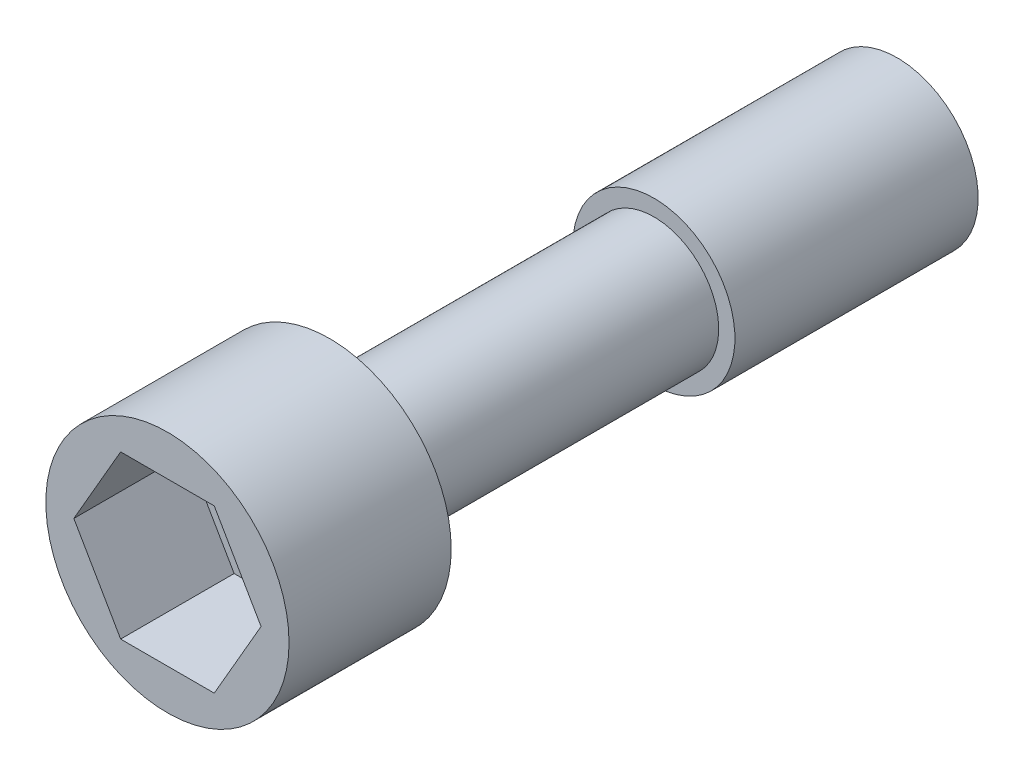
ISO-10303-21;
HEADER;
FILE_DESCRIPTION(('STEP AP214'),'2;1');
FILE_NAME('part.step','',(''),(''),'','','');
FILE_SCHEMA(('AUTOMOTIVE_DESIGN { 1 0 10303 214 1 1 1 1 }'));
ENDSEC;
DATA;
#1=APPLICATION_CONTEXT('core data for automotive mechanical design processes');
#2=APPLICATION_PROTOCOL_DEFINITION('international standard','automotive_design',2000,#1);
#3=PRODUCT_CONTEXT('',#1,'mechanical');
#4=PRODUCT('Part','Part','',(#3));
#5=PRODUCT_RELATED_PRODUCT_CATEGORY('part','',(#4));
#6=PRODUCT_DEFINITION_FORMATION('','',#4);
#7=PRODUCT_DEFINITION_CONTEXT('part definition',#1,'design');
#8=PRODUCT_DEFINITION('design','',#6,#7);
#9=PRODUCT_DEFINITION_SHAPE('','',#8);
#10=(LENGTH_UNIT() NAMED_UNIT(*) SI_UNIT(.MILLI.,.METRE.));
#11=(NAMED_UNIT(*) PLANE_ANGLE_UNIT() SI_UNIT($,.RADIAN.));
#12=(NAMED_UNIT(*) SI_UNIT($,.STERADIAN.) SOLID_ANGLE_UNIT());
#13=UNCERTAINTY_MEASURE_WITH_UNIT(LENGTH_MEASURE(1.E-05),#10,'distance_accuracy_value','');
#14=(GEOMETRIC_REPRESENTATION_CONTEXT(3) GLOBAL_UNCERTAINTY_ASSIGNED_CONTEXT((#13)) GLOBAL_UNIT_ASSIGNED_CONTEXT((#10,
#11,#12)) REPRESENTATION_CONTEXT('',''));
#15=CARTESIAN_POINT('',(0.,0.,0.));
#16=DIRECTION('',(0.,0.,1.));
#17=DIRECTION('',(1.,0.,0.));
#18=AXIS2_PLACEMENT_3D('',#15,#16,#17);
#19=CARTESIAN_POINT('',(0.,0.,10.));
#20=DIRECTION('',(0.,0.,-1.));
#21=DIRECTION('',(-1.,0.,0.));
#22=AXIS2_PLACEMENT_3D('',#19,#20,#21);
#23=CYLINDRICAL_SURFACE('',#22,7.5);
#24=CARTESIAN_POINT('',(0.,0.,10.));
#25=DIRECTION('',(0.,0.,1.));
#26=DIRECTION('',(1.,0.,0.));
#27=AXIS2_PLACEMENT_3D('',#24,#25,#26);
#28=CIRCLE('',#27,7.5);
#29=CARTESIAN_POINT('',(7.5,0.,10.));
#30=VERTEX_POINT('',#29);
#31=EDGE_CURVE('E54',#30,#30,#28,.T.);
#32=ORIENTED_EDGE('',*,*,#31,.F.);
#33=EDGE_LOOP('',(#32));
#34=FACE_BOUND('',#33,.T.);
#35=CARTESIAN_POINT('',(0.,0.,0.));
#36=DIRECTION('',(0.,0.,1.));
#37=DIRECTION('',(1.,0.,0.));
#38=AXIS2_PLACEMENT_3D('',#35,#36,#37);
#39=CIRCLE('',#38,7.5);
#40=CARTESIAN_POINT('',(7.5,0.,0.));
#41=VERTEX_POINT('',#40);
#42=EDGE_CURVE('E48',#41,#41,#39,.T.);
#43=ORIENTED_EDGE('',*,*,#42,.T.);
#44=EDGE_LOOP('',(#43));
#45=FACE_BOUND('',#44,.T.);
#46=ADVANCED_FACE('F45',(#34,#45),#23,.T.);
#47=CARTESIAN_POINT('',(0.,0.,10.));
#48=DIRECTION('',(0.,0.,1.));
#49=DIRECTION('',(1.,0.,0.));
#50=AXIS2_PLACEMENT_3D('',#47,#48,#49);
#51=PLANE('',#50);
#52=DIRECTION('',(-0.5,0.866025403784439,0.));
#53=VECTOR('',#52,1.);
#54=CARTESIAN_POINT('',(5.77350269189626,0.,10.));
#55=LINE('',#54,#53);
#56=CARTESIAN_POINT('',(5.77350269189626,0.,10.));
#57=VERTEX_POINT('',#56);
#58=CARTESIAN_POINT('',(2.88675134594813,5.,10.));
#59=VERTEX_POINT('',#58);
#60=EDGE_CURVE('E62',#57,#59,#55,.T.);
#61=ORIENTED_EDGE('',*,*,#60,.F.);
#62=DIRECTION('',(0.5,0.866025403784439,0.));
#63=VECTOR('',#62,1.);
#64=CARTESIAN_POINT('',(2.88675134594813,-5.,10.));
#65=LINE('',#64,#63);
#66=CARTESIAN_POINT('',(2.88675134594813,-5.,10.));
#67=VERTEX_POINT('',#66);
#68=EDGE_CURVE('E155',#67,#57,#65,.T.);
#69=ORIENTED_EDGE('',*,*,#68,.F.);
#70=DIRECTION('',(1.,0.,0.));
#71=VECTOR('',#70,1.);
#72=CARTESIAN_POINT('',(-2.88675134594813,-5.,10.));
#73=LINE('',#72,#71);
#74=CARTESIAN_POINT('',(-2.88675134594813,-5.,10.));
#75=VERTEX_POINT('',#74);
#76=EDGE_CURVE('E152',#75,#67,#73,.T.);
#77=ORIENTED_EDGE('',*,*,#76,.F.);
#78=DIRECTION('',(0.5,-0.866025403784438,0.));
#79=VECTOR('',#78,1.);
#80=CARTESIAN_POINT('',(-5.77350269189626,0.,10.));
#81=LINE('',#80,#79);
#82=CARTESIAN_POINT('',(-5.77350269189626,0.,10.));
#83=VERTEX_POINT('',#82);
#84=EDGE_CURVE('E110',#83,#75,#81,.T.);
#85=ORIENTED_EDGE('',*,*,#84,.F.);
#86=DIRECTION('',(-0.5,-0.866025403784439,0.));
#87=VECTOR('',#86,1.);
#88=CARTESIAN_POINT('',(-2.88675134594813,5.,10.));
#89=LINE('',#88,#87);
#90=CARTESIAN_POINT('',(-2.88675134594813,5.,10.));
#91=VERTEX_POINT('',#90);
#92=EDGE_CURVE('E146',#91,#83,#89,.T.);
#93=ORIENTED_EDGE('',*,*,#92,.F.);
#94=DIRECTION('',(-1.,0.,0.));
#95=VECTOR('',#94,1.);
#96=CARTESIAN_POINT('',(2.88675134594813,5.,10.));
#97=LINE('',#96,#95);
#98=EDGE_CURVE('E142',#59,#91,#97,.T.);
#99=ORIENTED_EDGE('',*,*,#98,.F.);
#100=EDGE_LOOP('',(#61,#69,#77,#85,#93,#99));
#101=FACE_BOUND('',#100,.T.);
#102=ORIENTED_EDGE('',*,*,#31,.T.);
#103=EDGE_LOOP('',(#102));
#104=FACE_BOUND('',#103,.T.);
#105=ADVANCED_FACE('F193',(#101,#104),#51,.T.);
#106=CARTESIAN_POINT('',(0.,0.,0.));
#107=DIRECTION('',(0.,0.,1.));
#108=DIRECTION('',(1.,0.,0.));
#109=AXIS2_PLACEMENT_3D('',#106,#107,#108);
#110=PLANE('',#109);
#111=CARTESIAN_POINT('',(0.,0.,0.));
#112=DIRECTION('',(0.,0.,-1.));
#113=DIRECTION('',(-1.,0.,0.));
#114=AXIS2_PLACEMENT_3D('',#111,#112,#113);
#115=CIRCLE('',#114,4.);
#116=CARTESIAN_POINT('',(-4.,0.,0.));
#117=VERTEX_POINT('',#116);
#118=EDGE_CURVE('E11',#117,#117,#115,.T.);
#119=ORIENTED_EDGE('',*,*,#118,.F.);
#120=EDGE_LOOP('',(#119));
#121=FACE_BOUND('',#120,.T.);
#122=ORIENTED_EDGE('',*,*,#42,.F.);
#123=EDGE_LOOP('',(#122));
#124=FACE_BOUND('',#123,.T.);
#125=ADVANCED_FACE('F190',(#121,#124),#110,.F.);
#126=CARTESIAN_POINT('',(0.,0.,-20.));
#127=DIRECTION('',(0.,0.,1.));
#128=DIRECTION('',(1.,0.,0.));
#129=AXIS2_PLACEMENT_3D('',#126,#127,#128);
#130=CYLINDRICAL_SURFACE('',#129,4.);
#131=CARTESIAN_POINT('',(0.,0.,-20.));
#132=DIRECTION('',(0.,0.,-1.));
#133=DIRECTION('',(-1.,0.,0.));
#134=AXIS2_PLACEMENT_3D('',#131,#132,#133);
#135=CIRCLE('',#134,4.);
#136=CARTESIAN_POINT('',(-4.,0.,-20.));
#137=VERTEX_POINT('',#136);
#138=EDGE_CURVE('E175',#137,#137,#135,.T.);
#139=ORIENTED_EDGE('',*,*,#138,.F.);
#140=EDGE_LOOP('',(#139));
#141=FACE_BOUND('',#140,.T.);
#142=ORIENTED_EDGE('',*,*,#118,.T.);
#143=EDGE_LOOP('',(#142));
#144=FACE_BOUND('',#143,.T.);
#145=ADVANCED_FACE('F192',(#141,#144),#130,.T.);
#146=CARTESIAN_POINT('',(0.,0.,-35.));
#147=DIRECTION('',(0.,0.,1.));
#148=DIRECTION('',(1.,0.,0.));
#149=AXIS2_PLACEMENT_3D('',#146,#147,#148);
#150=CYLINDRICAL_SURFACE('',#149,5.);
#151=CARTESIAN_POINT('',(0.,0.,-35.));
#152=DIRECTION('',(0.,0.,-1.));
#153=DIRECTION('',(-1.,0.,0.));
#154=AXIS2_PLACEMENT_3D('',#151,#152,#153);
#155=CIRCLE('',#154,5.);
#156=CARTESIAN_POINT('',(-5.,0.,-35.));
#157=VERTEX_POINT('',#156);
#158=EDGE_CURVE('E171',#157,#157,#155,.T.);
#159=ORIENTED_EDGE('',*,*,#158,.F.);
#160=EDGE_LOOP('',(#159));
#161=FACE_BOUND('',#160,.T.);
#162=CARTESIAN_POINT('',(0.,0.,-20.));
#163=DIRECTION('',(0.,0.,-1.));
#164=DIRECTION('',(-1.,0.,0.));
#165=AXIS2_PLACEMENT_3D('',#162,#163,#164);
#166=CIRCLE('',#165,5.);
#167=CARTESIAN_POINT('',(-5.,0.,-20.));
#168=VERTEX_POINT('',#167);
#169=EDGE_CURVE('E161',#168,#168,#166,.T.);
#170=ORIENTED_EDGE('',*,*,#169,.T.);
#171=EDGE_LOOP('',(#170));
#172=FACE_BOUND('',#171,.T.);
#173=ADVANCED_FACE('F199',(#161,#172),#150,.T.);
#174=CARTESIAN_POINT('',(0.,0.,-35.));
#175=DIRECTION('',(0.,0.,-1.));
#176=DIRECTION('',(-1.,0.,0.));
#177=AXIS2_PLACEMENT_3D('',#174,#175,#176);
#178=PLANE('',#177);
#179=ORIENTED_EDGE('',*,*,#158,.T.);
#180=EDGE_LOOP('',(#179));
#181=FACE_BOUND('',#180,.T.);
#182=ADVANCED_FACE('F237',(#181),#178,.T.);
#183=CARTESIAN_POINT('',(0.,0.,-20.));
#184=DIRECTION('',(0.,0.,-1.));
#185=DIRECTION('',(-1.,0.,0.));
#186=AXIS2_PLACEMENT_3D('',#183,#184,#185);
#187=PLANE('',#186);
#188=ORIENTED_EDGE('',*,*,#138,.T.);
#189=EDGE_LOOP('',(#188));
#190=FACE_BOUND('',#189,.T.);
#191=ORIENTED_EDGE('',*,*,#169,.F.);
#192=EDGE_LOOP('',(#191));
#193=FACE_BOUND('',#192,.T.);
#194=ADVANCED_FACE('F247',(#190,#193),#187,.F.);
#195=CARTESIAN_POINT('',(5.77350269189626,0.,3.));
#196=DIRECTION('',(0.866025403784439,0.5,0.));
#197=DIRECTION('',(-0.5,0.866025403784439,0.));
#198=AXIS2_PLACEMENT_3D('',#195,#196,#197);
#199=PLANE('',#198);
#200=ORIENTED_EDGE('',*,*,#60,.T.);
#201=DIRECTION('',(0.,0.,1.));
#202=VECTOR('',#201,1.);
#203=CARTESIAN_POINT('',(2.88675134594813,5.,3.));
#204=LINE('',#203,#202);
#205=CARTESIAN_POINT('',(2.88675134594813,5.,3.));
#206=VERTEX_POINT('',#205);
#207=EDGE_CURVE('E92',#206,#59,#204,.T.);
#208=ORIENTED_EDGE('',*,*,#207,.F.);
#209=DIRECTION('',(-0.5,0.866025403784439,0.));
#210=VECTOR('',#209,1.);
#211=CARTESIAN_POINT('',(5.77350269189626,0.,3.));
#212=LINE('',#211,#210);
#213=CARTESIAN_POINT('',(5.77350269189626,0.,3.));
#214=VERTEX_POINT('',#213);
#215=EDGE_CURVE('E158',#214,#206,#212,.T.);
#216=ORIENTED_EDGE('',*,*,#215,.F.);
#217=DIRECTION('',(0.,0.,1.));
#218=VECTOR('',#217,1.);
#219=CARTESIAN_POINT('',(5.77350269189626,0.,3.));
#220=LINE('',#219,#218);
#221=EDGE_CURVE('E70',#214,#57,#220,.T.);
#222=ORIENTED_EDGE('',*,*,#221,.T.);
#223=EDGE_LOOP('',(#200,#208,#216,#222));
#224=FACE_BOUND('',#223,.T.);
#225=ADVANCED_FACE('F256',(#224),#199,.F.);
#226=CARTESIAN_POINT('',(2.88675134594813,-5.,3.));
#227=DIRECTION('',(0.866025403784439,-0.5,0.));
#228=DIRECTION('',(0.5,0.866025403784439,0.));
#229=AXIS2_PLACEMENT_3D('',#226,#227,#228);
#230=PLANE('',#229);
#231=ORIENTED_EDGE('',*,*,#68,.T.);
#232=ORIENTED_EDGE('',*,*,#221,.F.);
#233=DIRECTION('',(0.5,0.866025403784439,0.));
#234=VECTOR('',#233,1.);
#235=CARTESIAN_POINT('',(2.88675134594813,-5.,3.));
#236=LINE('',#235,#234);
#237=CARTESIAN_POINT('',(2.88675134594813,-5.,3.));
#238=VERTEX_POINT('',#237);
#239=EDGE_CURVE('E124',#238,#214,#236,.T.);
#240=ORIENTED_EDGE('',*,*,#239,.F.);
#241=DIRECTION('',(0.,0.,1.));
#242=VECTOR('',#241,1.);
#243=CARTESIAN_POINT('',(2.88675134594813,-5.,3.));
#244=LINE('',#243,#242);
#245=EDGE_CURVE('E115',#238,#67,#244,.T.);
#246=ORIENTED_EDGE('',*,*,#245,.T.);
#247=EDGE_LOOP('',(#231,#232,#240,#246));
#248=FACE_BOUND('',#247,.T.);
#249=ADVANCED_FACE('F265',(#248),#230,.F.);
#250=CARTESIAN_POINT('',(-2.88675134594813,-5.,3.));
#251=DIRECTION('',(0.,-1.,0.));
#252=DIRECTION('',(0.,0.,-1.));
#253=AXIS2_PLACEMENT_3D('',#250,#251,#252);
#254=PLANE('',#253);
#255=ORIENTED_EDGE('',*,*,#76,.T.);
#256=ORIENTED_EDGE('',*,*,#245,.F.);
#257=DIRECTION('',(1.,0.,0.));
#258=VECTOR('',#257,1.);
#259=CARTESIAN_POINT('',(-2.88675134594813,-5.,3.));
#260=LINE('',#259,#258);
#261=CARTESIAN_POINT('',(-2.88675134594813,-5.,3.));
#262=VERTEX_POINT('',#261);
#263=EDGE_CURVE('E119',#262,#238,#260,.T.);
#264=ORIENTED_EDGE('',*,*,#263,.F.);
#265=DIRECTION('',(0.,0.,1.));
#266=VECTOR('',#265,1.);
#267=CARTESIAN_POINT('',(-2.88675134594813,-5.,3.));
#268=LINE('',#267,#266);
#269=EDGE_CURVE('E103',#262,#75,#268,.T.);
#270=ORIENTED_EDGE('',*,*,#269,.T.);
#271=EDGE_LOOP('',(#255,#256,#264,#270));
#272=FACE_BOUND('',#271,.T.);
#273=ADVANCED_FACE('F120',(#272),#254,.F.);
#274=CARTESIAN_POINT('',(-5.77350269189626,0.,3.));
#275=DIRECTION('',(-0.866025403784438,-0.5,0.));
#276=DIRECTION('',(0.5,-0.866025403784439,0.));
#277=AXIS2_PLACEMENT_3D('',#274,#275,#276);
#278=PLANE('',#277);
#279=ORIENTED_EDGE('',*,*,#84,.T.);
#280=ORIENTED_EDGE('',*,*,#269,.F.);
#281=DIRECTION('',(0.5,-0.866025403784438,0.));
#282=VECTOR('',#281,1.);
#283=CARTESIAN_POINT('',(-5.77350269189626,0.,3.));
#284=LINE('',#283,#282);
#285=CARTESIAN_POINT('',(-5.77350269189626,0.,3.));
#286=VERTEX_POINT('',#285);
#287=EDGE_CURVE('E107',#286,#262,#284,.T.);
#288=ORIENTED_EDGE('',*,*,#287,.F.);
#289=DIRECTION('',(0.,0.,1.));
#290=VECTOR('',#289,1.);
#291=CARTESIAN_POINT('',(-5.77350269189626,0.,3.));
#292=LINE('',#291,#290);
#293=EDGE_CURVE('E116',#286,#83,#292,.T.);
#294=ORIENTED_EDGE('',*,*,#293,.T.);
#295=EDGE_LOOP('',(#279,#280,#288,#294));
#296=FACE_BOUND('',#295,.T.);
#297=ADVANCED_FACE('F105',(#296),#278,.F.);
#298=CARTESIAN_POINT('',(-2.88675134594813,5.,3.));
#299=DIRECTION('',(-0.866025403784439,0.5,0.));
#300=DIRECTION('',(-0.5,-0.866025403784439,0.));
#301=AXIS2_PLACEMENT_3D('',#298,#299,#300);
#302=PLANE('',#301);
#303=ORIENTED_EDGE('',*,*,#92,.T.);
#304=ORIENTED_EDGE('',*,*,#293,.F.);
#305=DIRECTION('',(-0.5,-0.866025403784439,0.));
#306=VECTOR('',#305,1.);
#307=CARTESIAN_POINT('',(-2.88675134594813,5.,3.));
#308=LINE('',#307,#306);
#309=CARTESIAN_POINT('',(-2.88675134594813,5.,3.));
#310=VERTEX_POINT('',#309);
#311=EDGE_CURVE('E130',#310,#286,#308,.T.);
#312=ORIENTED_EDGE('',*,*,#311,.F.);
#313=DIRECTION('',(0.,0.,1.));
#314=VECTOR('',#313,1.);
#315=CARTESIAN_POINT('',(-2.88675134594813,5.,3.));
#316=LINE('',#315,#314);
#317=EDGE_CURVE('E166',#310,#91,#316,.T.);
#318=ORIENTED_EDGE('',*,*,#317,.T.);
#319=EDGE_LOOP('',(#303,#304,#312,#318));
#320=FACE_BOUND('',#319,.T.);
#321=ADVANCED_FACE('F290',(#320),#302,.F.);
#322=CARTESIAN_POINT('',(2.88675134594813,5.,3.));
#323=DIRECTION('',(0.,1.,0.));
#324=DIRECTION('',(0.,0.,1.));
#325=AXIS2_PLACEMENT_3D('',#322,#323,#324);
#326=PLANE('',#325);
#327=ORIENTED_EDGE('',*,*,#98,.T.);
#328=ORIENTED_EDGE('',*,*,#317,.F.);
#329=DIRECTION('',(-1.,0.,0.));
#330=VECTOR('',#329,1.);
#331=CARTESIAN_POINT('',(2.88675134594813,5.,3.));
#332=LINE('',#331,#330);
#333=EDGE_CURVE('E134',#206,#310,#332,.T.);
#334=ORIENTED_EDGE('',*,*,#333,.F.);
#335=ORIENTED_EDGE('',*,*,#207,.T.);
#336=EDGE_LOOP('',(#327,#328,#334,#335));
#337=FACE_BOUND('',#336,.T.);
#338=ADVANCED_FACE('F299',(#337),#326,.F.);
#339=CARTESIAN_POINT('',(0.,0.,3.));
#340=DIRECTION('',(0.,0.,1.));
#341=DIRECTION('',(1.,0.,0.));
#342=AXIS2_PLACEMENT_3D('',#339,#340,#341);
#343=PLANE('',#342);
#344=ORIENTED_EDGE('',*,*,#215,.T.);
#345=ORIENTED_EDGE('',*,*,#333,.T.);
#346=ORIENTED_EDGE('',*,*,#311,.T.);
#347=ORIENTED_EDGE('',*,*,#287,.T.);
#348=ORIENTED_EDGE('',*,*,#263,.T.);
#349=ORIENTED_EDGE('',*,*,#239,.T.);
#350=EDGE_LOOP('',(#344,#345,#346,#347,#348,#349));
#351=FACE_BOUND('',#350,.T.);
#352=ADVANCED_FACE('F127',(#351),#343,.T.);
#353=CLOSED_SHELL('',(#46,#105,#125,#145,#173,#182,#194,#225,#249,#273,#297,#321,#338,#352));
#354=MANIFOLD_SOLID_BREP('B2',#353);
#355=ADVANCED_BREP_SHAPE_REPRESENTATION('',(#18,#354),#14);
#356=SHAPE_DEFINITION_REPRESENTATION(#9,#355);
ENDSEC;
END-ISO-10303-21;
